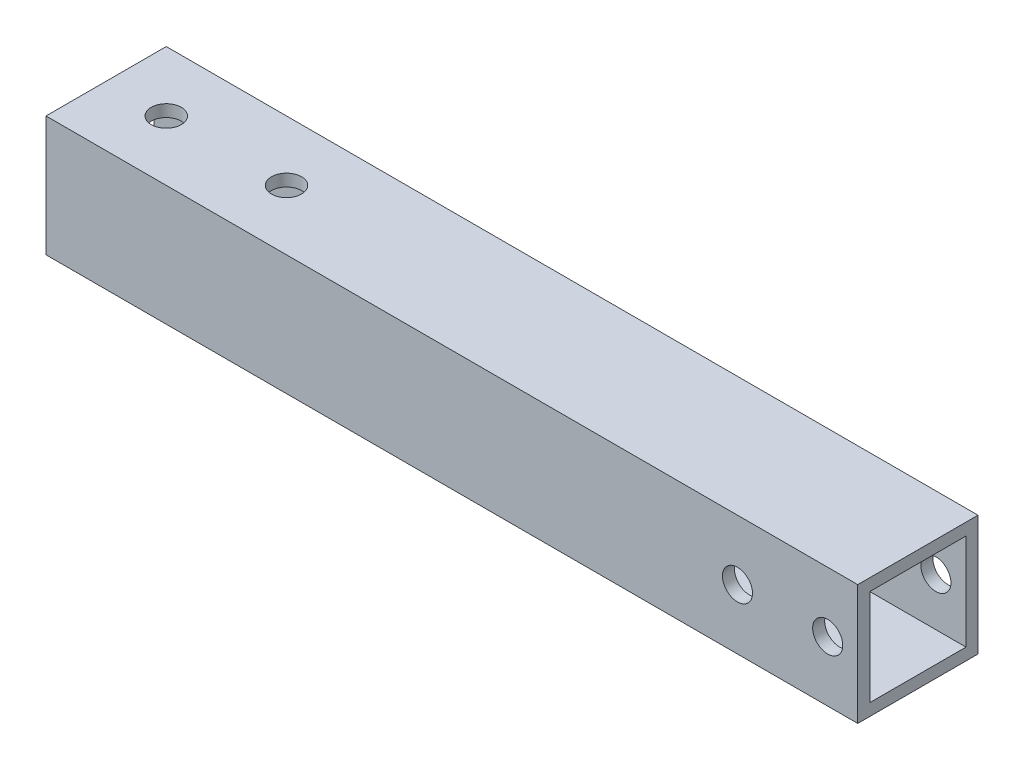
ISO-10303-21;
HEADER;
FILE_DESCRIPTION(('STEP AP214'),'2;1');
FILE_NAME('part.step','',(''),(''),'','','');
FILE_SCHEMA(('AUTOMOTIVE_DESIGN { 1 0 10303 214 1 1 1 1 }'));
ENDSEC;
DATA;
#1=APPLICATION_CONTEXT('core data for automotive mechanical design processes');
#2=APPLICATION_PROTOCOL_DEFINITION('international standard','automotive_design',2000,#1);
#3=PRODUCT_CONTEXT('',#1,'mechanical');
#4=PRODUCT('Part','Part','',(#3));
#5=PRODUCT_RELATED_PRODUCT_CATEGORY('part','',(#4));
#6=PRODUCT_DEFINITION_FORMATION('','',#4);
#7=PRODUCT_DEFINITION_CONTEXT('part definition',#1,'design');
#8=PRODUCT_DEFINITION('design','',#6,#7);
#9=PRODUCT_DEFINITION_SHAPE('','',#8);
#10=(LENGTH_UNIT() NAMED_UNIT(*) SI_UNIT(.MILLI.,.METRE.));
#11=(NAMED_UNIT(*) PLANE_ANGLE_UNIT() SI_UNIT($,.RADIAN.));
#12=(NAMED_UNIT(*) SI_UNIT($,.STERADIAN.) SOLID_ANGLE_UNIT());
#13=UNCERTAINTY_MEASURE_WITH_UNIT(LENGTH_MEASURE(1.E-05),#10,'distance_accuracy_value','');
#14=(GEOMETRIC_REPRESENTATION_CONTEXT(3) GLOBAL_UNCERTAINTY_ASSIGNED_CONTEXT((#13)) GLOBAL_UNIT_ASSIGNED_CONTEXT((#10,
#11,#12)) REPRESENTATION_CONTEXT('',''));
#15=CARTESIAN_POINT('',(0.,0.,0.));
#16=DIRECTION('',(0.,0.,1.));
#17=DIRECTION('',(1.,0.,0.));
#18=AXIS2_PLACEMENT_3D('',#15,#16,#17);
#19=CARTESIAN_POINT('',(135.,0.,0.));
#20=DIRECTION('',(1.,0.,0.));
#21=DIRECTION('',(0.,0.,-1.));
#22=AXIS2_PLACEMENT_3D('',#19,#20,#21);
#23=PLANE('',#22);
#24=DIRECTION('',(0.,1.,0.));
#25=VECTOR('',#24,1.);
#26=CARTESIAN_POINT('',(135.,10.,-10.));
#27=LINE('',#26,#25);
#28=CARTESIAN_POINT('',(135.,-10.,-10.));
#29=VERTEX_POINT('',#28);
#30=CARTESIAN_POINT('',(135.,10.,-10.));
#31=VERTEX_POINT('',#30);
#32=EDGE_CURVE('E143',#29,#31,#27,.T.);
#33=ORIENTED_EDGE('',*,*,#32,.T.);
#34=DIRECTION('',(0.,0.,1.));
#35=VECTOR('',#34,1.);
#36=CARTESIAN_POINT('',(135.,10.,9.99999999999999));
#37=LINE('',#36,#35);
#38=CARTESIAN_POINT('',(135.,10.,9.99999999999999));
#39=VERTEX_POINT('',#38);
#40=EDGE_CURVE('E146',#31,#39,#37,.T.);
#41=ORIENTED_EDGE('',*,*,#40,.T.);
#42=DIRECTION('',(0.,-1.,0.));
#43=VECTOR('',#42,1.);
#44=CARTESIAN_POINT('',(135.,10.,9.99999999999999));
#45=LINE('',#44,#43);
#46=CARTESIAN_POINT('',(135.,-10.,9.99999999999999));
#47=VERTEX_POINT('',#46);
#48=EDGE_CURVE('E149',#39,#47,#45,.T.);
#49=ORIENTED_EDGE('',*,*,#48,.T.);
#50=DIRECTION('',(0.,0.,-1.));
#51=VECTOR('',#50,1.);
#52=CARTESIAN_POINT('',(135.,-10.,9.99999999999999));
#53=LINE('',#52,#51);
#54=EDGE_CURVE('E151',#47,#29,#53,.T.);
#55=ORIENTED_EDGE('',*,*,#54,.T.);
#56=EDGE_LOOP('',(#33,#41,#49,#55));
#57=FACE_BOUND('',#56,.T.);
#58=DIRECTION('',(0.,0.,1.));
#59=VECTOR('',#58,1.);
#60=CARTESIAN_POINT('',(135.,8.,8.));
#61=LINE('',#60,#59);
#62=CARTESIAN_POINT('',(135.,8.,-8.));
#63=VERTEX_POINT('',#62);
#64=CARTESIAN_POINT('',(135.,8.,8.));
#65=VERTEX_POINT('',#64);
#66=EDGE_CURVE('E113',#63,#65,#61,.T.);
#67=ORIENTED_EDGE('',*,*,#66,.F.);
#68=DIRECTION('',(0.,1.,0.));
#69=VECTOR('',#68,1.);
#70=CARTESIAN_POINT('',(135.,8.,-8.));
#71=LINE('',#70,#69);
#72=CARTESIAN_POINT('',(135.,-8.,-8.));
#73=VERTEX_POINT('',#72);
#74=EDGE_CURVE('E105',#73,#63,#71,.T.);
#75=ORIENTED_EDGE('',*,*,#74,.F.);
#76=DIRECTION('',(0.,0.,-1.));
#77=VECTOR('',#76,1.);
#78=CARTESIAN_POINT('',(135.,-8.,8.));
#79=LINE('',#78,#77);
#80=CARTESIAN_POINT('',(135.,-8.,8.));
#81=VERTEX_POINT('',#80);
#82=EDGE_CURVE('E127',#81,#73,#79,.T.);
#83=ORIENTED_EDGE('',*,*,#82,.F.);
#84=DIRECTION('',(0.,-1.,0.));
#85=VECTOR('',#84,1.);
#86=CARTESIAN_POINT('',(135.,8.,8.));
#87=LINE('',#86,#85);
#88=EDGE_CURVE('E125',#65,#81,#87,.T.);
#89=ORIENTED_EDGE('',*,*,#88,.F.);
#90=EDGE_LOOP('',(#67,#75,#83,#89));
#91=FACE_BOUND('',#90,.T.);
#92=ADVANCED_FACE('F38',(#57,#91),#23,.T.);
#93=CARTESIAN_POINT('',(0.,0.,0.));
#94=DIRECTION('',(1.,0.,0.));
#95=DIRECTION('',(0.,0.,-1.));
#96=AXIS2_PLACEMENT_3D('',#93,#94,#95);
#97=PLANE('',#96);
#98=DIRECTION('',(0.,1.,0.));
#99=VECTOR('',#98,1.);
#100=CARTESIAN_POINT('',(0.,10.,-10.));
#101=LINE('',#100,#99);
#102=CARTESIAN_POINT('',(0.,-10.,-10.));
#103=VERTEX_POINT('',#102);
#104=CARTESIAN_POINT('',(0.,10.,-10.));
#105=VERTEX_POINT('',#104);
#106=EDGE_CURVE('E121',#103,#105,#101,.T.);
#107=ORIENTED_EDGE('',*,*,#106,.F.);
#108=DIRECTION('',(0.,0.,-1.));
#109=VECTOR('',#108,1.);
#110=CARTESIAN_POINT('',(0.,-10.,9.99999999999999));
#111=LINE('',#110,#109);
#112=CARTESIAN_POINT('',(0.,-10.,9.99999999999999));
#113=VERTEX_POINT('',#112);
#114=EDGE_CURVE('E147',#113,#103,#111,.T.);
#115=ORIENTED_EDGE('',*,*,#114,.F.);
#116=DIRECTION('',(0.,-1.,0.));
#117=VECTOR('',#116,1.);
#118=CARTESIAN_POINT('',(0.,10.,9.99999999999999));
#119=LINE('',#118,#117);
#120=CARTESIAN_POINT('',(0.,10.,9.99999999999999));
#121=VERTEX_POINT('',#120);
#122=EDGE_CURVE('E158',#121,#113,#119,.T.);
#123=ORIENTED_EDGE('',*,*,#122,.F.);
#124=DIRECTION('',(0.,0.,1.));
#125=VECTOR('',#124,1.);
#126=CARTESIAN_POINT('',(0.,10.,9.99999999999999));
#127=LINE('',#126,#125);
#128=EDGE_CURVE('E156',#105,#121,#127,.T.);
#129=ORIENTED_EDGE('',*,*,#128,.F.);
#130=EDGE_LOOP('',(#107,#115,#123,#129));
#131=FACE_BOUND('',#130,.T.);
#132=DIRECTION('',(0.,1.,0.));
#133=VECTOR('',#132,1.);
#134=CARTESIAN_POINT('',(0.,8.,-8.));
#135=LINE('',#134,#133);
#136=CARTESIAN_POINT('',(0.,-8.,-8.));
#137=VERTEX_POINT('',#136);
#138=CARTESIAN_POINT('',(0.,8.,-8.));
#139=VERTEX_POINT('',#138);
#140=EDGE_CURVE('E63',#137,#139,#135,.T.);
#141=ORIENTED_EDGE('',*,*,#140,.T.);
#142=DIRECTION('',(0.,0.,1.));
#143=VECTOR('',#142,1.);
#144=CARTESIAN_POINT('',(0.,8.,8.));
#145=LINE('',#144,#143);
#146=CARTESIAN_POINT('',(0.,8.,8.));
#147=VERTEX_POINT('',#146);
#148=EDGE_CURVE('E120',#139,#147,#145,.T.);
#149=ORIENTED_EDGE('',*,*,#148,.T.);
#150=DIRECTION('',(0.,-1.,0.));
#151=VECTOR('',#150,1.);
#152=CARTESIAN_POINT('',(0.,8.,8.));
#153=LINE('',#152,#151);
#154=CARTESIAN_POINT('',(0.,-8.,8.));
#155=VERTEX_POINT('',#154);
#156=EDGE_CURVE('E135',#147,#155,#153,.T.);
#157=ORIENTED_EDGE('',*,*,#156,.T.);
#158=DIRECTION('',(0.,0.,-1.));
#159=VECTOR('',#158,1.);
#160=CARTESIAN_POINT('',(0.,-8.,8.));
#161=LINE('',#160,#159);
#162=EDGE_CURVE('E114',#155,#137,#161,.T.);
#163=ORIENTED_EDGE('',*,*,#162,.T.);
#164=EDGE_LOOP('',(#141,#149,#157,#163));
#165=FACE_BOUND('',#164,.T.);
#166=ADVANCED_FACE('F235',(#131,#165),#97,.F.);
#167=CARTESIAN_POINT('',(135.,10.,-10.));
#168=DIRECTION('',(0.,0.,1.));
#169=DIRECTION('',(1.,0.,0.));
#170=AXIS2_PLACEMENT_3D('',#167,#168,#169);
#171=PLANE('',#170);
#172=CARTESIAN_POINT('',(130.,0.,-10.));
#173=DIRECTION('',(0.,0.,1.));
#174=DIRECTION('',(1.,0.,0.));
#175=AXIS2_PLACEMENT_3D('',#172,#173,#174);
#176=CIRCLE('',#175,2.5);
#177=CARTESIAN_POINT('',(132.5,0.,-10.));
#178=VERTEX_POINT('',#177);
#179=EDGE_CURVE('E172',#178,#178,#176,.T.);
#180=ORIENTED_EDGE('',*,*,#179,.T.);
#181=EDGE_LOOP('',(#180));
#182=FACE_BOUND('',#181,.T.);
#183=CARTESIAN_POINT('',(115.,0.,-10.));
#184=DIRECTION('',(0.,0.,1.));
#185=DIRECTION('',(1.,0.,0.));
#186=AXIS2_PLACEMENT_3D('',#183,#184,#185);
#187=CIRCLE('',#186,2.50000000000001);
#188=CARTESIAN_POINT('',(117.5,0.,-10.));
#189=VERTEX_POINT('',#188);
#190=EDGE_CURVE('E206',#189,#189,#187,.T.);
#191=ORIENTED_EDGE('',*,*,#190,.T.);
#192=EDGE_LOOP('',(#191));
#193=FACE_BOUND('',#192,.T.);
#194=ORIENTED_EDGE('',*,*,#106,.T.);
#195=DIRECTION('',(-1.,0.,0.));
#196=VECTOR('',#195,1.);
#197=CARTESIAN_POINT('',(135.,10.,-10.));
#198=LINE('',#197,#196);
#199=EDGE_CURVE('E11',#31,#105,#198,.T.);
#200=ORIENTED_EDGE('',*,*,#199,.F.);
#201=ORIENTED_EDGE('',*,*,#32,.F.);
#202=DIRECTION('',(-1.,0.,0.));
#203=VECTOR('',#202,1.);
#204=CARTESIAN_POINT('',(135.,-10.,-10.));
#205=LINE('',#204,#203);
#206=EDGE_CURVE('E153',#29,#103,#205,.T.);
#207=ORIENTED_EDGE('',*,*,#206,.T.);
#208=EDGE_LOOP('',(#194,#200,#201,#207));
#209=FACE_BOUND('',#208,.T.);
#210=ADVANCED_FACE('F40',(#182,#193,#209),#171,.F.);
#211=CARTESIAN_POINT('',(135.,10.,9.99999999999999));
#212=DIRECTION('',(0.,-1.,0.));
#213=DIRECTION('',(0.,0.,-1.));
#214=AXIS2_PLACEMENT_3D('',#211,#212,#213);
#215=PLANE('',#214);
#216=CARTESIAN_POINT('',(10.,10.,0.));
#217=DIRECTION('',(0.,1.,0.));
#218=DIRECTION('',(0.,0.,1.));
#219=AXIS2_PLACEMENT_3D('',#216,#217,#218);
#220=CIRCLE('',#219,2.5);
#221=CARTESIAN_POINT('',(10.,10.,2.5));
#222=VERTEX_POINT('',#221);
#223=EDGE_CURVE('E184',#222,#222,#220,.T.);
#224=ORIENTED_EDGE('',*,*,#223,.F.);
#225=EDGE_LOOP('',(#224));
#226=FACE_BOUND('',#225,.T.);
#227=CARTESIAN_POINT('',(30.,10.,0.));
#228=DIRECTION('',(0.,1.,0.));
#229=DIRECTION('',(0.,0.,1.));
#230=AXIS2_PLACEMENT_3D('',#227,#228,#229);
#231=CIRCLE('',#230,2.5);
#232=CARTESIAN_POINT('',(30.,10.,2.5));
#233=VERTEX_POINT('',#232);
#234=EDGE_CURVE('E194',#233,#233,#231,.T.);
#235=ORIENTED_EDGE('',*,*,#234,.F.);
#236=EDGE_LOOP('',(#235));
#237=FACE_BOUND('',#236,.T.);
#238=ORIENTED_EDGE('',*,*,#128,.T.);
#239=DIRECTION('',(-1.,0.,0.));
#240=VECTOR('',#239,1.);
#241=CARTESIAN_POINT('',(135.,10.,9.99999999999999));
#242=LINE('',#241,#240);
#243=EDGE_CURVE('E47',#39,#121,#242,.T.);
#244=ORIENTED_EDGE('',*,*,#243,.F.);
#245=ORIENTED_EDGE('',*,*,#40,.F.);
#246=ORIENTED_EDGE('',*,*,#199,.T.);
#247=EDGE_LOOP('',(#238,#244,#245,#246));
#248=FACE_BOUND('',#247,.T.);
#249=ADVANCED_FACE('F234',(#226,#237,#248),#215,.F.);
#250=CARTESIAN_POINT('',(135.,10.,9.99999999999999));
#251=DIRECTION('',(0.,0.,-1.));
#252=DIRECTION('',(-1.,0.,0.));
#253=AXIS2_PLACEMENT_3D('',#250,#251,#252);
#254=PLANE('',#253);
#255=CARTESIAN_POINT('',(130.,0.,9.99999999999999));
#256=DIRECTION('',(0.,0.,1.));
#257=DIRECTION('',(1.,0.,0.));
#258=AXIS2_PLACEMENT_3D('',#255,#256,#257);
#259=CIRCLE('',#258,2.5);
#260=CARTESIAN_POINT('',(132.5,0.,9.99999999999999));
#261=VERTEX_POINT('',#260);
#262=EDGE_CURVE('E203',#261,#261,#259,.T.);
#263=ORIENTED_EDGE('',*,*,#262,.F.);
#264=EDGE_LOOP('',(#263));
#265=FACE_BOUND('',#264,.T.);
#266=CARTESIAN_POINT('',(115.,0.,9.99999999999999));
#267=DIRECTION('',(0.,0.,1.));
#268=DIRECTION('',(1.,0.,0.));
#269=AXIS2_PLACEMENT_3D('',#266,#267,#268);
#270=CIRCLE('',#269,2.50000000000001);
#271=CARTESIAN_POINT('',(117.5,0.,9.99999999999999));
#272=VERTEX_POINT('',#271);
#273=EDGE_CURVE('E200',#272,#272,#270,.T.);
#274=ORIENTED_EDGE('',*,*,#273,.F.);
#275=EDGE_LOOP('',(#274));
#276=FACE_BOUND('',#275,.T.);
#277=ORIENTED_EDGE('',*,*,#122,.T.);
#278=DIRECTION('',(-1.,0.,0.));
#279=VECTOR('',#278,1.);
#280=CARTESIAN_POINT('',(135.,-10.,9.99999999999999));
#281=LINE('',#280,#279);
#282=EDGE_CURVE('E163',#47,#113,#281,.T.);
#283=ORIENTED_EDGE('',*,*,#282,.F.);
#284=ORIENTED_EDGE('',*,*,#48,.F.);
#285=ORIENTED_EDGE('',*,*,#243,.T.);
#286=EDGE_LOOP('',(#277,#283,#284,#285));
#287=FACE_BOUND('',#286,.T.);
#288=ADVANCED_FACE('F253',(#265,#276,#287),#254,.F.);
#289=CARTESIAN_POINT('',(135.,-10.,9.99999999999999));
#290=DIRECTION('',(0.,1.,0.));
#291=DIRECTION('',(0.,0.,1.));
#292=AXIS2_PLACEMENT_3D('',#289,#290,#291);
#293=PLANE('',#292);
#294=CARTESIAN_POINT('',(10.,-10.,0.));
#295=DIRECTION('',(0.,1.,0.));
#296=DIRECTION('',(0.,0.,1.));
#297=AXIS2_PLACEMENT_3D('',#294,#295,#296);
#298=CIRCLE('',#297,2.5);
#299=CARTESIAN_POINT('',(10.,-10.,2.5));
#300=VERTEX_POINT('',#299);
#301=EDGE_CURVE('E178',#300,#300,#298,.T.);
#302=ORIENTED_EDGE('',*,*,#301,.T.);
#303=EDGE_LOOP('',(#302));
#304=FACE_BOUND('',#303,.T.);
#305=CARTESIAN_POINT('',(30.,-10.,0.));
#306=DIRECTION('',(0.,1.,0.));
#307=DIRECTION('',(0.,0.,1.));
#308=AXIS2_PLACEMENT_3D('',#305,#306,#307);
#309=CIRCLE('',#308,2.5);
#310=CARTESIAN_POINT('',(30.,-10.,2.5));
#311=VERTEX_POINT('',#310);
#312=EDGE_CURVE('E189',#311,#311,#309,.T.);
#313=ORIENTED_EDGE('',*,*,#312,.T.);
#314=EDGE_LOOP('',(#313));
#315=FACE_BOUND('',#314,.T.);
#316=ORIENTED_EDGE('',*,*,#114,.T.);
#317=ORIENTED_EDGE('',*,*,#206,.F.);
#318=ORIENTED_EDGE('',*,*,#54,.F.);
#319=ORIENTED_EDGE('',*,*,#282,.T.);
#320=EDGE_LOOP('',(#316,#317,#318,#319));
#321=FACE_BOUND('',#320,.T.);
#322=ADVANCED_FACE('F220',(#304,#315,#321),#293,.F.);
#323=CARTESIAN_POINT('',(135.,8.,-8.));
#324=DIRECTION('',(0.,0.,1.));
#325=DIRECTION('',(1.,0.,0.));
#326=AXIS2_PLACEMENT_3D('',#323,#324,#325);
#327=PLANE('',#326);
#328=CARTESIAN_POINT('',(130.,0.,-8.));
#329=DIRECTION('',(0.,0.,1.));
#330=DIRECTION('',(1.,0.,0.));
#331=AXIS2_PLACEMENT_3D('',#328,#329,#330);
#332=CIRCLE('',#331,2.5);
#333=CARTESIAN_POINT('',(132.5,0.,-8.));
#334=VERTEX_POINT('',#333);
#335=EDGE_CURVE('E133',#334,#334,#332,.T.);
#336=ORIENTED_EDGE('',*,*,#335,.F.);
#337=EDGE_LOOP('',(#336));
#338=FACE_BOUND('',#337,.T.);
#339=CARTESIAN_POINT('',(115.,0.,-8.));
#340=DIRECTION('',(0.,0.,1.));
#341=DIRECTION('',(1.,0.,0.));
#342=AXIS2_PLACEMENT_3D('',#339,#340,#341);
#343=CIRCLE('',#342,2.50000000000001);
#344=CARTESIAN_POINT('',(117.5,0.,-8.));
#345=VERTEX_POINT('',#344);
#346=EDGE_CURVE('E171',#345,#345,#343,.T.);
#347=ORIENTED_EDGE('',*,*,#346,.F.);
#348=EDGE_LOOP('',(#347));
#349=FACE_BOUND('',#348,.T.);
#350=ORIENTED_EDGE('',*,*,#140,.F.);
#351=DIRECTION('',(-1.,0.,0.));
#352=VECTOR('',#351,1.);
#353=CARTESIAN_POINT('',(135.,-8.,-8.));
#354=LINE('',#353,#352);
#355=EDGE_CURVE('E109',#73,#137,#354,.T.);
#356=ORIENTED_EDGE('',*,*,#355,.F.);
#357=ORIENTED_EDGE('',*,*,#74,.T.);
#358=DIRECTION('',(-1.,0.,0.));
#359=VECTOR('',#358,1.);
#360=CARTESIAN_POINT('',(135.,8.,-8.));
#361=LINE('',#360,#359);
#362=EDGE_CURVE('E108',#63,#139,#361,.T.);
#363=ORIENTED_EDGE('',*,*,#362,.T.);
#364=EDGE_LOOP('',(#350,#356,#357,#363));
#365=FACE_BOUND('',#364,.T.);
#366=ADVANCED_FACE('F107',(#338,#349,#365),#327,.T.);
#367=CARTESIAN_POINT('',(135.,8.,8.));
#368=DIRECTION('',(0.,-1.,0.));
#369=DIRECTION('',(0.,0.,-1.));
#370=AXIS2_PLACEMENT_3D('',#367,#368,#369);
#371=PLANE('',#370);
#372=CARTESIAN_POINT('',(10.,8.,0.));
#373=DIRECTION('',(0.,-1.,0.));
#374=DIRECTION('',(0.,0.,-1.));
#375=AXIS2_PLACEMENT_3D('',#372,#373,#374);
#376=CIRCLE('',#375,2.5);
#377=CARTESIAN_POINT('',(10.,8.,-2.5));
#378=VERTEX_POINT('',#377);
#379=EDGE_CURVE('E197',#378,#378,#376,.T.);
#380=ORIENTED_EDGE('',*,*,#379,.F.);
#381=EDGE_LOOP('',(#380));
#382=FACE_BOUND('',#381,.T.);
#383=CARTESIAN_POINT('',(30.,8.,0.));
#384=DIRECTION('',(0.,-1.,0.));
#385=DIRECTION('',(0.,0.,-1.));
#386=AXIS2_PLACEMENT_3D('',#383,#384,#385);
#387=CIRCLE('',#386,2.5);
#388=CARTESIAN_POINT('',(30.,8.,-2.5));
#389=VERTEX_POINT('',#388);
#390=EDGE_CURVE('E177',#389,#389,#387,.T.);
#391=ORIENTED_EDGE('',*,*,#390,.F.);
#392=EDGE_LOOP('',(#391));
#393=FACE_BOUND('',#392,.T.);
#394=ORIENTED_EDGE('',*,*,#148,.F.);
#395=ORIENTED_EDGE('',*,*,#362,.F.);
#396=ORIENTED_EDGE('',*,*,#66,.T.);
#397=DIRECTION('',(-1.,0.,0.));
#398=VECTOR('',#397,1.);
#399=CARTESIAN_POINT('',(135.,8.,8.));
#400=LINE('',#399,#398);
#401=EDGE_CURVE('E122',#65,#147,#400,.T.);
#402=ORIENTED_EDGE('',*,*,#401,.T.);
#403=EDGE_LOOP('',(#394,#395,#396,#402));
#404=FACE_BOUND('',#403,.T.);
#405=ADVANCED_FACE('F117',(#382,#393,#404),#371,.T.);
#406=CARTESIAN_POINT('',(135.,8.,8.));
#407=DIRECTION('',(0.,0.,-1.));
#408=DIRECTION('',(-1.,0.,0.));
#409=AXIS2_PLACEMENT_3D('',#406,#407,#408);
#410=PLANE('',#409);
#411=CARTESIAN_POINT('',(130.,0.,8.));
#412=DIRECTION('',(0.,0.,-1.));
#413=DIRECTION('',(-1.,0.,0.));
#414=AXIS2_PLACEMENT_3D('',#411,#412,#413);
#415=CIRCLE('',#414,2.5);
#416=CARTESIAN_POINT('',(127.5,0.,8.));
#417=VERTEX_POINT('',#416);
#418=EDGE_CURVE('E173',#417,#417,#415,.T.);
#419=ORIENTED_EDGE('',*,*,#418,.F.);
#420=EDGE_LOOP('',(#419));
#421=FACE_BOUND('',#420,.T.);
#422=CARTESIAN_POINT('',(115.,0.,8.));
#423=DIRECTION('',(0.,0.,-1.));
#424=DIRECTION('',(-1.,0.,0.));
#425=AXIS2_PLACEMENT_3D('',#422,#423,#424);
#426=CIRCLE('',#425,2.50000000000001);
#427=CARTESIAN_POINT('',(112.5,0.,8.));
#428=VERTEX_POINT('',#427);
#429=EDGE_CURVE('E168',#428,#428,#426,.T.);
#430=ORIENTED_EDGE('',*,*,#429,.F.);
#431=EDGE_LOOP('',(#430));
#432=FACE_BOUND('',#431,.T.);
#433=ORIENTED_EDGE('',*,*,#156,.F.);
#434=ORIENTED_EDGE('',*,*,#401,.F.);
#435=ORIENTED_EDGE('',*,*,#88,.T.);
#436=DIRECTION('',(-1.,0.,0.));
#437=VECTOR('',#436,1.);
#438=CARTESIAN_POINT('',(135.,-8.,8.));
#439=LINE('',#438,#437);
#440=EDGE_CURVE('E55',#81,#155,#439,.T.);
#441=ORIENTED_EDGE('',*,*,#440,.T.);
#442=EDGE_LOOP('',(#433,#434,#435,#441));
#443=FACE_BOUND('',#442,.T.);
#444=ADVANCED_FACE('F274',(#421,#432,#443),#410,.T.);
#445=CARTESIAN_POINT('',(135.,-8.,8.));
#446=DIRECTION('',(0.,1.,0.));
#447=DIRECTION('',(0.,0.,1.));
#448=AXIS2_PLACEMENT_3D('',#445,#446,#447);
#449=PLANE('',#448);
#450=CARTESIAN_POINT('',(10.,-8.,0.));
#451=DIRECTION('',(0.,1.,0.));
#452=DIRECTION('',(0.,0.,1.));
#453=AXIS2_PLACEMENT_3D('',#450,#451,#452);
#454=CIRCLE('',#453,2.5);
#455=CARTESIAN_POINT('',(10.,-8.,2.5));
#456=VERTEX_POINT('',#455);
#457=EDGE_CURVE('E42',#456,#456,#454,.T.);
#458=ORIENTED_EDGE('',*,*,#457,.F.);
#459=EDGE_LOOP('',(#458));
#460=FACE_BOUND('',#459,.T.);
#461=CARTESIAN_POINT('',(30.,-8.,0.));
#462=DIRECTION('',(0.,1.,0.));
#463=DIRECTION('',(0.,0.,1.));
#464=AXIS2_PLACEMENT_3D('',#461,#462,#463);
#465=CIRCLE('',#464,2.5);
#466=CARTESIAN_POINT('',(30.,-8.,2.5));
#467=VERTEX_POINT('',#466);
#468=EDGE_CURVE('E175',#467,#467,#465,.T.);
#469=ORIENTED_EDGE('',*,*,#468,.F.);
#470=EDGE_LOOP('',(#469));
#471=FACE_BOUND('',#470,.T.);
#472=ORIENTED_EDGE('',*,*,#162,.F.);
#473=ORIENTED_EDGE('',*,*,#440,.F.);
#474=ORIENTED_EDGE('',*,*,#82,.T.);
#475=ORIENTED_EDGE('',*,*,#355,.T.);
#476=EDGE_LOOP('',(#472,#473,#474,#475));
#477=FACE_BOUND('',#476,.T.);
#478=ADVANCED_FACE('F278',(#460,#471,#477),#449,.T.);
#479=CARTESIAN_POINT('',(115.,0.,-10.));
#480=DIRECTION('',(0.,0.,1.));
#481=DIRECTION('',(1.,0.,0.));
#482=AXIS2_PLACEMENT_3D('',#479,#480,#481);
#483=CYLINDRICAL_SURFACE('',#482,2.50000000000001);
#484=ORIENTED_EDGE('',*,*,#429,.T.);
#485=EDGE_LOOP('',(#484));
#486=FACE_BOUND('',#485,.T.);
#487=ORIENTED_EDGE('',*,*,#273,.T.);
#488=EDGE_LOOP('',(#487));
#489=FACE_BOUND('',#488,.T.);
#490=ADVANCED_FACE('F229',(#486,#489),#483,.F.);
#491=CARTESIAN_POINT('',(130.,0.,-10.));
#492=DIRECTION('',(0.,0.,1.));
#493=DIRECTION('',(1.,0.,0.));
#494=AXIS2_PLACEMENT_3D('',#491,#492,#493);
#495=CYLINDRICAL_SURFACE('',#494,2.5);
#496=ORIENTED_EDGE('',*,*,#418,.T.);
#497=EDGE_LOOP('',(#496));
#498=FACE_BOUND('',#497,.T.);
#499=ORIENTED_EDGE('',*,*,#262,.T.);
#500=EDGE_LOOP('',(#499));
#501=FACE_BOUND('',#500,.T.);
#502=ADVANCED_FACE('F227',(#498,#501),#495,.F.);
#503=ORIENTED_EDGE('',*,*,#346,.T.);
#504=EDGE_LOOP('',(#503));
#505=FACE_BOUND('',#504,.T.);
#506=ORIENTED_EDGE('',*,*,#190,.F.);
#507=EDGE_LOOP('',(#506));
#508=FACE_BOUND('',#507,.T.);
#509=ADVANCED_FACE('F224',(#505,#508),#483,.F.);
#510=ORIENTED_EDGE('',*,*,#335,.T.);
#511=EDGE_LOOP('',(#510));
#512=FACE_BOUND('',#511,.T.);
#513=ORIENTED_EDGE('',*,*,#179,.F.);
#514=EDGE_LOOP('',(#513));
#515=FACE_BOUND('',#514,.T.);
#516=ADVANCED_FACE('F215',(#512,#515),#495,.F.);
#517=CARTESIAN_POINT('',(30.,-10.,0.));
#518=DIRECTION('',(0.,1.,0.));
#519=DIRECTION('',(0.,0.,1.));
#520=AXIS2_PLACEMENT_3D('',#517,#518,#519);
#521=CYLINDRICAL_SURFACE('',#520,2.5);
#522=ORIENTED_EDGE('',*,*,#468,.T.);
#523=EDGE_LOOP('',(#522));
#524=FACE_BOUND('',#523,.T.);
#525=ORIENTED_EDGE('',*,*,#312,.F.);
#526=EDGE_LOOP('',(#525));
#527=FACE_BOUND('',#526,.T.);
#528=ADVANCED_FACE('F288',(#524,#527),#521,.F.);
#529=CARTESIAN_POINT('',(10.,-10.,0.));
#530=DIRECTION('',(0.,1.,0.));
#531=DIRECTION('',(0.,0.,1.));
#532=AXIS2_PLACEMENT_3D('',#529,#530,#531);
#533=CYLINDRICAL_SURFACE('',#532,2.5);
#534=ORIENTED_EDGE('',*,*,#457,.T.);
#535=EDGE_LOOP('',(#534));
#536=FACE_BOUND('',#535,.T.);
#537=ORIENTED_EDGE('',*,*,#301,.F.);
#538=EDGE_LOOP('',(#537));
#539=FACE_BOUND('',#538,.T.);
#540=ADVANCED_FACE('F291',(#536,#539),#533,.F.);
#541=ORIENTED_EDGE('',*,*,#390,.T.);
#542=EDGE_LOOP('',(#541));
#543=FACE_BOUND('',#542,.T.);
#544=ORIENTED_EDGE('',*,*,#234,.T.);
#545=EDGE_LOOP('',(#544));
#546=FACE_BOUND('',#545,.T.);
#547=ADVANCED_FACE('F292',(#543,#546),#521,.F.);
#548=ORIENTED_EDGE('',*,*,#379,.T.);
#549=EDGE_LOOP('',(#548));
#550=FACE_BOUND('',#549,.T.);
#551=ORIENTED_EDGE('',*,*,#223,.T.);
#552=EDGE_LOOP('',(#551));
#553=FACE_BOUND('',#552,.T.);
#554=ADVANCED_FACE('F295',(#550,#553),#533,.F.);
#555=CLOSED_SHELL('',(#92,#166,#210,#249,#288,#322,#366,#405,#444,#478,#490,#502,#509,#516,#528,
#540,#547,#554));
#556=MANIFOLD_SOLID_BREP('B2',#555);
#557=ADVANCED_BREP_SHAPE_REPRESENTATION('',(#18,#556),#14);
#558=SHAPE_DEFINITION_REPRESENTATION(#9,#557);
ENDSEC;
END-ISO-10303-21;
